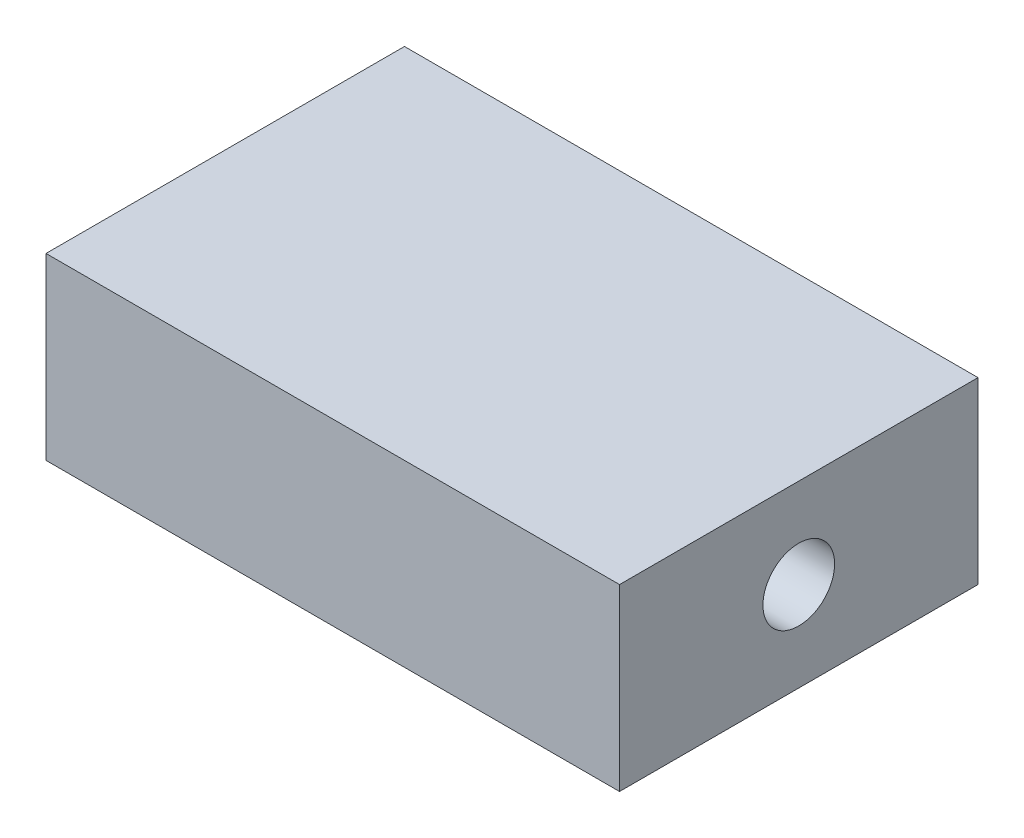
ISO-10303-21;
HEADER;
FILE_DESCRIPTION(('STEP AP214'),'2;1');
FILE_NAME('part.step','',(''),(''),'','','');
FILE_SCHEMA(('AUTOMOTIVE_DESIGN { 1 0 10303 214 1 1 1 1 }'));
ENDSEC;
DATA;
#1=APPLICATION_CONTEXT('core data for automotive mechanical design processes');
#2=APPLICATION_PROTOCOL_DEFINITION('international standard','automotive_design',2000,#1);
#3=PRODUCT_CONTEXT('',#1,'mechanical');
#4=PRODUCT('Part','Part','',(#3));
#5=PRODUCT_RELATED_PRODUCT_CATEGORY('part','',(#4));
#6=PRODUCT_DEFINITION_FORMATION('','',#4);
#7=PRODUCT_DEFINITION_CONTEXT('part definition',#1,'design');
#8=PRODUCT_DEFINITION('design','',#6,#7);
#9=PRODUCT_DEFINITION_SHAPE('','',#8);
#10=(LENGTH_UNIT() NAMED_UNIT(*) SI_UNIT(.MILLI.,.METRE.));
#11=(NAMED_UNIT(*) PLANE_ANGLE_UNIT() SI_UNIT($,.RADIAN.));
#12=(NAMED_UNIT(*) SI_UNIT($,.STERADIAN.) SOLID_ANGLE_UNIT());
#13=UNCERTAINTY_MEASURE_WITH_UNIT(LENGTH_MEASURE(1.E-05),#10,'distance_accuracy_value','');
#14=(GEOMETRIC_REPRESENTATION_CONTEXT(3) GLOBAL_UNCERTAINTY_ASSIGNED_CONTEXT((#13)) GLOBAL_UNIT_ASSIGNED_CONTEXT((#10,
#11,#12)) REPRESENTATION_CONTEXT('',''));
#15=CARTESIAN_POINT('',(0.,0.,0.));
#16=DIRECTION('',(0.,0.,1.));
#17=DIRECTION('',(1.,0.,0.));
#18=AXIS2_PLACEMENT_3D('',#15,#16,#17);
#19=CARTESIAN_POINT('',(40.,25.,25.));
#20=DIRECTION('',(-1.,0.,0.));
#21=DIRECTION('',(0.,0.,1.));
#22=AXIS2_PLACEMENT_3D('',#19,#20,#21);
#23=PLANE('',#22);
#24=CARTESIAN_POINT('',(40.,12.5,0.));
#25=DIRECTION('',(1.,0.,0.));
#26=DIRECTION('',(0.,0.,-1.));
#27=AXIS2_PLACEMENT_3D('',#24,#25,#26);
#28=CIRCLE('',#27,5.);
#29=CARTESIAN_POINT('',(40.,12.5,-5.));
#30=VERTEX_POINT('',#29);
#31=EDGE_CURVE('E111',#30,#30,#28,.T.);
#32=ORIENTED_EDGE('',*,*,#31,.F.);
#33=EDGE_LOOP('',(#32));
#34=FACE_BOUND('',#33,.T.);
#35=DIRECTION('',(0.,0.,-1.));
#36=VECTOR('',#35,1.);
#37=CARTESIAN_POINT('',(40.,0.,25.));
#38=LINE('',#37,#36);
#39=CARTESIAN_POINT('',(40.,0.,25.));
#40=VERTEX_POINT('',#39);
#41=CARTESIAN_POINT('',(40.,0.,-25.));
#42=VERTEX_POINT('',#41);
#43=EDGE_CURVE('E95',#40,#42,#38,.T.);
#44=ORIENTED_EDGE('',*,*,#43,.T.);
#45=DIRECTION('',(0.,-1.,0.));
#46=VECTOR('',#45,1.);
#47=CARTESIAN_POINT('',(40.,25.,-25.));
#48=LINE('',#47,#46);
#49=CARTESIAN_POINT('',(40.,25.,-25.));
#50=VERTEX_POINT('',#49);
#51=EDGE_CURVE('E11',#50,#42,#48,.T.);
#52=ORIENTED_EDGE('',*,*,#51,.F.);
#53=DIRECTION('',(0.,0.,-1.));
#54=VECTOR('',#53,1.);
#55=CARTESIAN_POINT('',(40.,25.,25.));
#56=LINE('',#55,#54);
#57=CARTESIAN_POINT('',(40.,25.,25.));
#58=VERTEX_POINT('',#57);
#59=EDGE_CURVE('E83',#58,#50,#56,.T.);
#60=ORIENTED_EDGE('',*,*,#59,.F.);
#61=DIRECTION('',(0.,-1.,0.));
#62=VECTOR('',#61,1.);
#63=CARTESIAN_POINT('',(40.,25.,25.));
#64=LINE('',#63,#62);
#65=EDGE_CURVE('E91',#58,#40,#64,.T.);
#66=ORIENTED_EDGE('',*,*,#65,.T.);
#67=EDGE_LOOP('',(#44,#52,#60,#66));
#68=FACE_BOUND('',#67,.T.);
#69=ADVANCED_FACE('F32',(#34,#68),#23,.F.);
#70=CARTESIAN_POINT('',(-40.,25.,-25.));
#71=DIRECTION('',(0.,0.,1.));
#72=DIRECTION('',(1.,0.,0.));
#73=AXIS2_PLACEMENT_3D('',#70,#71,#72);
#74=PLANE('',#73);
#75=DIRECTION('',(-1.,0.,0.));
#76=VECTOR('',#75,1.);
#77=CARTESIAN_POINT('',(-40.,0.,-25.));
#78=LINE('',#77,#76);
#79=CARTESIAN_POINT('',(-40.,0.,-25.));
#80=VERTEX_POINT('',#79);
#81=EDGE_CURVE('E87',#42,#80,#78,.T.);
#82=ORIENTED_EDGE('',*,*,#81,.T.);
#83=DIRECTION('',(0.,-1.,0.));
#84=VECTOR('',#83,1.);
#85=CARTESIAN_POINT('',(-40.,25.,-25.));
#86=LINE('',#85,#84);
#87=CARTESIAN_POINT('',(-40.,25.,-25.));
#88=VERTEX_POINT('',#87);
#89=EDGE_CURVE('E40',#88,#80,#86,.T.);
#90=ORIENTED_EDGE('',*,*,#89,.F.);
#91=DIRECTION('',(-1.,0.,0.));
#92=VECTOR('',#91,1.);
#93=CARTESIAN_POINT('',(-40.,25.,-25.));
#94=LINE('',#93,#92);
#95=EDGE_CURVE('E78',#50,#88,#94,.T.);
#96=ORIENTED_EDGE('',*,*,#95,.F.);
#97=ORIENTED_EDGE('',*,*,#51,.T.);
#98=EDGE_LOOP('',(#82,#90,#96,#97));
#99=FACE_BOUND('',#98,.T.);
#100=ADVANCED_FACE('F86',(#99),#74,.F.);
#101=CARTESIAN_POINT('',(-40.,25.,25.));
#102=DIRECTION('',(1.,0.,0.));
#103=DIRECTION('',(0.,0.,-1.));
#104=AXIS2_PLACEMENT_3D('',#101,#102,#103);
#105=PLANE('',#104);
#106=CARTESIAN_POINT('',(-40.,12.5,0.));
#107=DIRECTION('',(1.,0.,0.));
#108=DIRECTION('',(0.,0.,-1.));
#109=AXIS2_PLACEMENT_3D('',#106,#107,#108);
#110=CIRCLE('',#109,5.);
#111=CARTESIAN_POINT('',(-40.,12.5,-5.));
#112=VERTEX_POINT('',#111);
#113=EDGE_CURVE('E98',#112,#112,#110,.T.);
#114=ORIENTED_EDGE('',*,*,#113,.T.);
#115=EDGE_LOOP('',(#114));
#116=FACE_BOUND('',#115,.T.);
#117=DIRECTION('',(0.,0.,1.));
#118=VECTOR('',#117,1.);
#119=CARTESIAN_POINT('',(-40.,0.,25.));
#120=LINE('',#119,#118);
#121=CARTESIAN_POINT('',(-40.,0.,25.));
#122=VERTEX_POINT('',#121);
#123=EDGE_CURVE('E65',#80,#122,#120,.T.);
#124=ORIENTED_EDGE('',*,*,#123,.T.);
#125=DIRECTION('',(0.,-1.,0.));
#126=VECTOR('',#125,1.);
#127=CARTESIAN_POINT('',(-40.,25.,25.));
#128=LINE('',#127,#126);
#129=CARTESIAN_POINT('',(-40.,25.,25.));
#130=VERTEX_POINT('',#129);
#131=EDGE_CURVE('E88',#130,#122,#128,.T.);
#132=ORIENTED_EDGE('',*,*,#131,.F.);
#133=DIRECTION('',(0.,0.,1.));
#134=VECTOR('',#133,1.);
#135=CARTESIAN_POINT('',(-40.,25.,25.));
#136=LINE('',#135,#134);
#137=EDGE_CURVE('E81',#88,#130,#136,.T.);
#138=ORIENTED_EDGE('',*,*,#137,.F.);
#139=ORIENTED_EDGE('',*,*,#89,.T.);
#140=EDGE_LOOP('',(#124,#132,#138,#139));
#141=FACE_BOUND('',#140,.T.);
#142=ADVANCED_FACE('F89',(#116,#141),#105,.F.);
#143=CARTESIAN_POINT('',(-40.,25.,25.));
#144=DIRECTION('',(0.,0.,-1.));
#145=DIRECTION('',(-1.,0.,0.));
#146=AXIS2_PLACEMENT_3D('',#143,#144,#145);
#147=PLANE('',#146);
#148=DIRECTION('',(1.,0.,0.));
#149=VECTOR('',#148,1.);
#150=CARTESIAN_POINT('',(-40.,0.,25.));
#151=LINE('',#150,#149);
#152=EDGE_CURVE('E71',#122,#40,#151,.T.);
#153=ORIENTED_EDGE('',*,*,#152,.T.);
#154=ORIENTED_EDGE('',*,*,#65,.F.);
#155=DIRECTION('',(1.,0.,0.));
#156=VECTOR('',#155,1.);
#157=CARTESIAN_POINT('',(-40.,25.,25.));
#158=LINE('',#157,#156);
#159=EDGE_CURVE('E48',#130,#58,#158,.T.);
#160=ORIENTED_EDGE('',*,*,#159,.F.);
#161=ORIENTED_EDGE('',*,*,#131,.T.);
#162=EDGE_LOOP('',(#153,#154,#160,#161));
#163=FACE_BOUND('',#162,.T.);
#164=ADVANCED_FACE('F103',(#163),#147,.F.);
#165=CARTESIAN_POINT('',(0.,25.,0.));
#166=DIRECTION('',(0.,-1.,0.));
#167=DIRECTION('',(0.,0.,-1.));
#168=AXIS2_PLACEMENT_3D('',#165,#166,#167);
#169=PLANE('',#168);
#170=ORIENTED_EDGE('',*,*,#59,.T.);
#171=ORIENTED_EDGE('',*,*,#95,.T.);
#172=ORIENTED_EDGE('',*,*,#137,.T.);
#173=ORIENTED_EDGE('',*,*,#159,.T.);
#174=EDGE_LOOP('',(#170,#171,#172,#173));
#175=FACE_BOUND('',#174,.T.);
#176=ADVANCED_FACE('F79',(#175),#169,.F.);
#177=CARTESIAN_POINT('',(0.,0.,0.));
#178=DIRECTION('',(0.,-1.,0.));
#179=DIRECTION('',(0.,0.,-1.));
#180=AXIS2_PLACEMENT_3D('',#177,#178,#179);
#181=PLANE('',#180);
#182=ORIENTED_EDGE('',*,*,#43,.F.);
#183=ORIENTED_EDGE('',*,*,#152,.F.);
#184=ORIENTED_EDGE('',*,*,#123,.F.);
#185=ORIENTED_EDGE('',*,*,#81,.F.);
#186=EDGE_LOOP('',(#182,#183,#184,#185));
#187=FACE_BOUND('',#186,.T.);
#188=ADVANCED_FACE('F106',(#187),#181,.T.);
#189=CARTESIAN_POINT('',(-40.,12.5,0.));
#190=DIRECTION('',(1.,0.,0.));
#191=DIRECTION('',(0.,0.,-1.));
#192=AXIS2_PLACEMENT_3D('',#189,#190,#191);
#193=CYLINDRICAL_SURFACE('',#192,5.);
#194=ORIENTED_EDGE('',*,*,#113,.F.);
#195=EDGE_LOOP('',(#194));
#196=FACE_BOUND('',#195,.T.);
#197=ORIENTED_EDGE('',*,*,#31,.T.);
#198=EDGE_LOOP('',(#197));
#199=FACE_BOUND('',#198,.T.);
#200=ADVANCED_FACE('F115',(#196,#199),#193,.F.);
#201=CLOSED_SHELL('',(#69,#100,#142,#164,#176,#188,#200));
#202=MANIFOLD_SOLID_BREP('B2',#201);
#203=ADVANCED_BREP_SHAPE_REPRESENTATION('',(#18,#202),#14);
#204=SHAPE_DEFINITION_REPRESENTATION(#9,#203);
ENDSEC;
END-ISO-10303-21;
